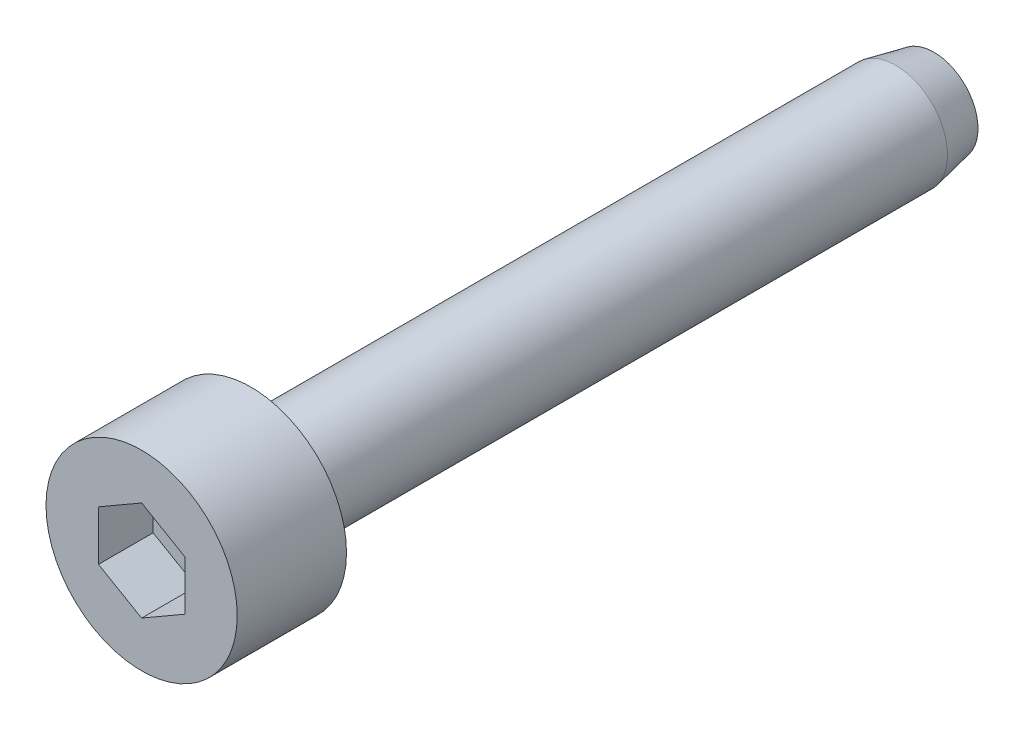
ISO-10303-21;
HEADER;
FILE_DESCRIPTION(('STEP AP214'),'2;1');
FILE_NAME('part.step','',(''),(''),'','','');
FILE_SCHEMA(('AUTOMOTIVE_DESIGN { 1 0 10303 214 1 1 1 1 }'));
ENDSEC;
DATA;
#1=APPLICATION_CONTEXT('core data for automotive mechanical design processes');
#2=APPLICATION_PROTOCOL_DEFINITION('international standard','automotive_design',2000,#1);
#3=PRODUCT_CONTEXT('',#1,'mechanical');
#4=PRODUCT('Part','Part','',(#3));
#5=PRODUCT_RELATED_PRODUCT_CATEGORY('part','',(#4));
#6=PRODUCT_DEFINITION_FORMATION('','',#4);
#7=PRODUCT_DEFINITION_CONTEXT('part definition',#1,'design');
#8=PRODUCT_DEFINITION('design','',#6,#7);
#9=PRODUCT_DEFINITION_SHAPE('','',#8);
#10=(LENGTH_UNIT() NAMED_UNIT(*) SI_UNIT(.MILLI.,.METRE.));
#11=(NAMED_UNIT(*) PLANE_ANGLE_UNIT() SI_UNIT($,.RADIAN.));
#12=(NAMED_UNIT(*) SI_UNIT($,.STERADIAN.) SOLID_ANGLE_UNIT());
#13=UNCERTAINTY_MEASURE_WITH_UNIT(LENGTH_MEASURE(1.E-05),#10,'distance_accuracy_value','');
#14=(GEOMETRIC_REPRESENTATION_CONTEXT(3) GLOBAL_UNCERTAINTY_ASSIGNED_CONTEXT((#13)) GLOBAL_UNIT_ASSIGNED_CONTEXT((#10,
#11,#12)) REPRESENTATION_CONTEXT('',''));
#15=CARTESIAN_POINT('',(0.,0.,0.));
#16=DIRECTION('',(0.,0.,1.));
#17=DIRECTION('',(1.,0.,0.));
#18=AXIS2_PLACEMENT_3D('',#15,#16,#17);
#19=CARTESIAN_POINT('',(0.,0.,-29.));
#20=DIRECTION('',(0.,0.,1.));
#21=DIRECTION('',(1.,0.,0.));
#22=AXIS2_PLACEMENT_3D('',#19,#20,#21);
#23=PLANE('',#22);
#24=CARTESIAN_POINT('',(0.,0.,-29.));
#25=DIRECTION('',(0.,0.,1.));
#26=DIRECTION('',(1.,0.,0.));
#27=AXIS2_PLACEMENT_3D('',#24,#25,#26);
#28=CIRCLE('',#27,1.615);
#29=CARTESIAN_POINT('',(1.615,0.,-29.));
#30=VERTEX_POINT('',#29);
#31=EDGE_CURVE('E11',#30,#30,#28,.T.);
#32=ORIENTED_EDGE('',*,*,#31,.F.);
#33=EDGE_LOOP('',(#32));
#34=FACE_BOUND('',#33,.T.);
#35=ADVANCED_FACE('F17',(#34),#23,.F.);
#36=CARTESIAN_POINT('',(0.,0.,-27.6));
#37=DIRECTION('',(0.,0.,1.));
#38=DIRECTION('',(1.,0.,0.));
#39=AXIS2_PLACEMENT_3D('',#36,#37,#38);
#40=CONICAL_SURFACE('',#39,1.9,0.20082725537);
#41=ORIENTED_EDGE('',*,*,#31,.T.);
#42=EDGE_LOOP('',(#41));
#43=FACE_BOUND('',#42,.T.);
#44=CARTESIAN_POINT('',(0.,0.,-27.6));
#45=DIRECTION('',(0.,0.,1.));
#46=DIRECTION('',(1.,0.,0.));
#47=AXIS2_PLACEMENT_3D('',#44,#45,#46);
#48=CIRCLE('',#47,1.9);
#49=CARTESIAN_POINT('',(1.9,0.,-27.6));
#50=VERTEX_POINT('',#49);
#51=EDGE_CURVE('E27',#50,#50,#48,.T.);
#52=ORIENTED_EDGE('',*,*,#51,.F.);
#53=EDGE_LOOP('',(#52));
#54=FACE_BOUND('',#53,.T.);
#55=ADVANCED_FACE('F19',(#43,#54),#40,.T.);
#56=CARTESIAN_POINT('',(0.,0.,-2.));
#57=DIRECTION('',(0.,0.,1.));
#58=DIRECTION('',(1.,0.,0.));
#59=AXIS2_PLACEMENT_3D('',#56,#57,#58);
#60=PLANE('',#59);
#61=DIRECTION('',(-0.866025403784329,0.50000000000019,0.));
#62=VECTOR('',#61,1.);
#63=CARTESIAN_POINT('',(1.58,0.91221342532,-2.));
#64=LINE('',#63,#62);
#65=CARTESIAN_POINT('',(1.58,0.91221342532,-2.));
#66=VERTEX_POINT('',#65);
#67=CARTESIAN_POINT('',(0.,1.824426850639,-2.));
#68=VERTEX_POINT('',#67);
#69=EDGE_CURVE('E96',#66,#68,#64,.T.);
#70=ORIENTED_EDGE('',*,*,#69,.T.);
#71=DIRECTION('',(-0.866025403784329,-0.50000000000019,0.));
#72=VECTOR('',#71,1.);
#73=CARTESIAN_POINT('',(0.,1.824426850639,-2.));
#74=LINE('',#73,#72);
#75=CARTESIAN_POINT('',(-1.58,0.91221342532,-2.));
#76=VERTEX_POINT('',#75);
#77=EDGE_CURVE('E126',#68,#76,#74,.T.);
#78=ORIENTED_EDGE('',*,*,#77,.T.);
#79=DIRECTION('',(0.,-1.,0.));
#80=VECTOR('',#79,1.);
#81=CARTESIAN_POINT('',(-1.58,0.91221342532,-2.));
#82=LINE('',#81,#80);
#83=CARTESIAN_POINT('',(-1.58,-0.91221342532,-2.));
#84=VERTEX_POINT('',#83);
#85=EDGE_CURVE('E149',#76,#84,#82,.T.);
#86=ORIENTED_EDGE('',*,*,#85,.T.);
#87=DIRECTION('',(0.866025403784329,-0.50000000000019,0.));
#88=VECTOR('',#87,1.);
#89=CARTESIAN_POINT('',(-1.58,-0.91221342532,-2.));
#90=LINE('',#89,#88);
#91=CARTESIAN_POINT('',(0.,-1.824426850639,-2.));
#92=VERTEX_POINT('',#91);
#93=EDGE_CURVE('E146',#84,#92,#90,.T.);
#94=ORIENTED_EDGE('',*,*,#93,.T.);
#95=DIRECTION('',(0.866025403784329,0.50000000000019,0.));
#96=VECTOR('',#95,1.);
#97=CARTESIAN_POINT('',(0.,-1.824426850639,-2.));
#98=LINE('',#97,#96);
#99=CARTESIAN_POINT('',(1.58,-0.91221342532,-2.));
#100=VERTEX_POINT('',#99);
#101=EDGE_CURVE('E50',#92,#100,#98,.T.);
#102=ORIENTED_EDGE('',*,*,#101,.T.);
#103=DIRECTION('',(0.,1.,0.));
#104=VECTOR('',#103,1.);
#105=CARTESIAN_POINT('',(1.58,-0.91221342532,-2.));
#106=LINE('',#105,#104);
#107=EDGE_CURVE('E36',#100,#66,#106,.T.);
#108=ORIENTED_EDGE('',*,*,#107,.T.);
#109=EDGE_LOOP('',(#70,#78,#86,#94,#102,#108));
#110=FACE_BOUND('',#109,.T.);
#111=ADVANCED_FACE('F177',(#110),#60,.T.);
#112=CARTESIAN_POINT('',(0.,0.,-29.));
#113=DIRECTION('',(0.,0.,1.));
#114=DIRECTION('',(1.,0.,0.));
#115=AXIS2_PLACEMENT_3D('',#112,#113,#114);
#116=CYLINDRICAL_SURFACE('',#115,1.9);
#117=CARTESIAN_POINT('',(0.,0.,-4.));
#118=DIRECTION('',(0.,0.,1.));
#119=DIRECTION('',(1.,0.,0.));
#120=AXIS2_PLACEMENT_3D('',#117,#118,#119);
#121=CIRCLE('',#120,1.9);
#122=CARTESIAN_POINT('',(1.9,0.,-4.));
#123=VERTEX_POINT('',#122);
#124=EDGE_CURVE('E147',#123,#123,#121,.T.);
#125=ORIENTED_EDGE('',*,*,#124,.F.);
#126=EDGE_LOOP('',(#125));
#127=FACE_BOUND('',#126,.T.);
#128=ORIENTED_EDGE('',*,*,#51,.T.);
#129=EDGE_LOOP('',(#128));
#130=FACE_BOUND('',#129,.T.);
#131=ADVANCED_FACE('F176',(#127,#130),#116,.T.);
#132=CARTESIAN_POINT('',(1.58,-0.91221342532,0.));
#133=DIRECTION('',(1.,0.,0.));
#134=DIRECTION('',(0.,1.,0.));
#135=AXIS2_PLACEMENT_3D('',#132,#133,#134);
#136=PLANE('',#135);
#137=DIRECTION('',(0.,1.,0.));
#138=VECTOR('',#137,1.);
#139=CARTESIAN_POINT('',(1.58,-0.91221342532,0.));
#140=LINE('',#139,#138);
#141=CARTESIAN_POINT('',(1.58,-0.91221342532,0.));
#142=VERTEX_POINT('',#141);
#143=CARTESIAN_POINT('',(1.58,0.91221342532,0.));
#144=VERTEX_POINT('',#143);
#145=EDGE_CURVE('E101',#142,#144,#140,.T.);
#146=ORIENTED_EDGE('',*,*,#145,.T.);
#147=DIRECTION('',(0.,0.,-1.));
#148=VECTOR('',#147,1.);
#149=CARTESIAN_POINT('',(1.58,0.91221342532,0.));
#150=LINE('',#149,#148);
#151=EDGE_CURVE('E90',#144,#66,#150,.T.);
#152=ORIENTED_EDGE('',*,*,#151,.T.);
#153=ORIENTED_EDGE('',*,*,#107,.F.);
#154=DIRECTION('',(0.,0.,-1.));
#155=VECTOR('',#154,1.);
#156=CARTESIAN_POINT('',(1.58,-0.91221342532,0.));
#157=LINE('',#156,#155);
#158=EDGE_CURVE('E103',#142,#100,#157,.T.);
#159=ORIENTED_EDGE('',*,*,#158,.F.);
#160=EDGE_LOOP('',(#146,#152,#153,#159));
#161=FACE_BOUND('',#160,.T.);
#162=ADVANCED_FACE('F105',(#161),#136,.F.);
#163=CARTESIAN_POINT('',(0.,-1.824426850639,0.));
#164=DIRECTION('',(0.50000000000019,-0.866025403784329,0.));
#165=DIRECTION('',(0.,0.,-1.));
#166=AXIS2_PLACEMENT_3D('',#163,#164,#165);
#167=PLANE('',#166);
#168=DIRECTION('',(0.866025403784329,0.50000000000019,0.));
#169=VECTOR('',#168,1.);
#170=CARTESIAN_POINT('',(0.,-1.824426850639,0.));
#171=LINE('',#170,#169);
#172=CARTESIAN_POINT('',(0.,-1.824426850639,0.));
#173=VERTEX_POINT('',#172);
#174=EDGE_CURVE('E107',#173,#142,#171,.T.);
#175=ORIENTED_EDGE('',*,*,#174,.T.);
#176=ORIENTED_EDGE('',*,*,#158,.T.);
#177=ORIENTED_EDGE('',*,*,#101,.F.);
#178=DIRECTION('',(0.,0.,-1.));
#179=VECTOR('',#178,1.);
#180=CARTESIAN_POINT('',(0.,-1.824426850639,0.));
#181=LINE('',#180,#179);
#182=EDGE_CURVE('E145',#173,#92,#181,.T.);
#183=ORIENTED_EDGE('',*,*,#182,.F.);
#184=EDGE_LOOP('',(#175,#176,#177,#183));
#185=FACE_BOUND('',#184,.T.);
#186=ADVANCED_FACE('F196',(#185),#167,.F.);
#187=CARTESIAN_POINT('',(-1.58,-0.91221342532,0.));
#188=DIRECTION('',(-0.50000000000019,-0.866025403784329,0.));
#189=DIRECTION('',(-0.866025403784329,0.50000000000019,0.));
#190=AXIS2_PLACEMENT_3D('',#187,#188,#189);
#191=PLANE('',#190);
#192=DIRECTION('',(0.866025403784329,-0.50000000000019,0.));
#193=VECTOR('',#192,1.);
#194=CARTESIAN_POINT('',(-1.58,-0.91221342532,0.));
#195=LINE('',#194,#193);
#196=CARTESIAN_POINT('',(-1.58,-0.91221342532,0.));
#197=VERTEX_POINT('',#196);
#198=EDGE_CURVE('E131',#197,#173,#195,.T.);
#199=ORIENTED_EDGE('',*,*,#198,.T.);
#200=ORIENTED_EDGE('',*,*,#182,.T.);
#201=ORIENTED_EDGE('',*,*,#93,.F.);
#202=DIRECTION('',(0.,0.,-1.));
#203=VECTOR('',#202,1.);
#204=CARTESIAN_POINT('',(-1.58,-0.91221342532,0.));
#205=LINE('',#204,#203);
#206=EDGE_CURVE('E127',#197,#84,#205,.T.);
#207=ORIENTED_EDGE('',*,*,#206,.F.);
#208=EDGE_LOOP('',(#199,#200,#201,#207));
#209=FACE_BOUND('',#208,.T.);
#210=ADVANCED_FACE('F193',(#209),#191,.F.);
#211=CARTESIAN_POINT('',(-1.58,0.91221342532,0.));
#212=DIRECTION('',(-1.,0.,0.));
#213=DIRECTION('',(0.,0.,1.));
#214=AXIS2_PLACEMENT_3D('',#211,#212,#213);
#215=PLANE('',#214);
#216=DIRECTION('',(0.,-1.,0.));
#217=VECTOR('',#216,1.);
#218=CARTESIAN_POINT('',(-1.58,0.91221342532,0.));
#219=LINE('',#218,#217);
#220=CARTESIAN_POINT('',(-1.58,0.91221342532,0.));
#221=VERTEX_POINT('',#220);
#222=EDGE_CURVE('E134',#221,#197,#219,.T.);
#223=ORIENTED_EDGE('',*,*,#222,.T.);
#224=ORIENTED_EDGE('',*,*,#206,.T.);
#225=ORIENTED_EDGE('',*,*,#85,.F.);
#226=DIRECTION('',(0.,0.,-1.));
#227=VECTOR('',#226,1.);
#228=CARTESIAN_POINT('',(-1.58,0.91221342532,0.));
#229=LINE('',#228,#227);
#230=EDGE_CURVE('E98',#221,#76,#229,.T.);
#231=ORIENTED_EDGE('',*,*,#230,.F.);
#232=EDGE_LOOP('',(#223,#224,#225,#231));
#233=FACE_BOUND('',#232,.T.);
#234=ADVANCED_FACE('F207',(#233),#215,.F.);
#235=CARTESIAN_POINT('',(0.,1.824426850639,0.));
#236=DIRECTION('',(-0.50000000000019,0.866025403784329,0.));
#237=DIRECTION('',(0.,0.,1.));
#238=AXIS2_PLACEMENT_3D('',#235,#236,#237);
#239=PLANE('',#238);
#240=DIRECTION('',(-0.866025403784329,-0.50000000000019,0.));
#241=VECTOR('',#240,1.);
#242=CARTESIAN_POINT('',(0.,1.824426850639,0.));
#243=LINE('',#242,#241);
#244=CARTESIAN_POINT('',(0.,1.824426850639,0.));
#245=VERTEX_POINT('',#244);
#246=EDGE_CURVE('E113',#245,#221,#243,.T.);
#247=ORIENTED_EDGE('',*,*,#246,.T.);
#248=ORIENTED_EDGE('',*,*,#230,.T.);
#249=ORIENTED_EDGE('',*,*,#77,.F.);
#250=DIRECTION('',(0.,0.,-1.));
#251=VECTOR('',#250,1.);
#252=CARTESIAN_POINT('',(0.,1.824426850639,0.));
#253=LINE('',#252,#251);
#254=EDGE_CURVE('E138',#245,#68,#253,.T.);
#255=ORIENTED_EDGE('',*,*,#254,.F.);
#256=EDGE_LOOP('',(#247,#248,#249,#255));
#257=FACE_BOUND('',#256,.T.);
#258=ADVANCED_FACE('F215',(#257),#239,.F.);
#259=CARTESIAN_POINT('',(1.58,0.91221342532,0.));
#260=DIRECTION('',(0.50000000000019,0.866025403784329,0.));
#261=DIRECTION('',(0.,0.,-1.));
#262=AXIS2_PLACEMENT_3D('',#259,#260,#261);
#263=PLANE('',#262);
#264=DIRECTION('',(-0.866025403784329,0.50000000000019,0.));
#265=VECTOR('',#264,1.);
#266=CARTESIAN_POINT('',(1.58,0.91221342532,0.));
#267=LINE('',#266,#265);
#268=EDGE_CURVE('E94',#144,#245,#267,.T.);
#269=ORIENTED_EDGE('',*,*,#268,.T.);
#270=ORIENTED_EDGE('',*,*,#254,.T.);
#271=ORIENTED_EDGE('',*,*,#69,.F.);
#272=ORIENTED_EDGE('',*,*,#151,.F.);
#273=EDGE_LOOP('',(#269,#270,#271,#272));
#274=FACE_BOUND('',#273,.T.);
#275=ADVANCED_FACE('F93',(#274),#263,.F.);
#276=CARTESIAN_POINT('',(0.,0.,-4.));
#277=DIRECTION('',(0.,0.,1.));
#278=DIRECTION('',(1.,0.,0.));
#279=AXIS2_PLACEMENT_3D('',#276,#277,#278);
#280=PLANE('',#279);
#281=ORIENTED_EDGE('',*,*,#124,.T.);
#282=EDGE_LOOP('',(#281));
#283=FACE_BOUND('',#282,.T.);
#284=CARTESIAN_POINT('',(0.,0.,-4.));
#285=DIRECTION('',(0.,0.,1.));
#286=DIRECTION('',(1.,0.,0.));
#287=AXIS2_PLACEMENT_3D('',#284,#285,#286);
#288=CIRCLE('',#287,3.5);
#289=CARTESIAN_POINT('',(3.5,0.,-4.));
#290=VERTEX_POINT('',#289);
#291=EDGE_CURVE('E117',#290,#290,#288,.T.);
#292=ORIENTED_EDGE('',*,*,#291,.F.);
#293=EDGE_LOOP('',(#292));
#294=FACE_BOUND('',#293,.T.);
#295=ADVANCED_FACE('F217',(#283,#294),#280,.F.);
#296=CARTESIAN_POINT('',(0.,0.,0.));
#297=DIRECTION('',(0.,0.,1.));
#298=DIRECTION('',(1.,0.,0.));
#299=AXIS2_PLACEMENT_3D('',#296,#297,#298);
#300=PLANE('',#299);
#301=ORIENTED_EDGE('',*,*,#268,.F.);
#302=ORIENTED_EDGE('',*,*,#145,.F.);
#303=ORIENTED_EDGE('',*,*,#174,.F.);
#304=ORIENTED_EDGE('',*,*,#198,.F.);
#305=ORIENTED_EDGE('',*,*,#222,.F.);
#306=ORIENTED_EDGE('',*,*,#246,.F.);
#307=EDGE_LOOP('',(#301,#302,#303,#304,#305,#306));
#308=FACE_BOUND('',#307,.T.);
#309=CARTESIAN_POINT('',(0.,0.,0.));
#310=DIRECTION('',(0.,0.,1.));
#311=DIRECTION('',(1.,0.,0.));
#312=AXIS2_PLACEMENT_3D('',#309,#310,#311);
#313=CIRCLE('',#312,3.5);
#314=CARTESIAN_POINT('',(3.5,0.,0.));
#315=VERTEX_POINT('',#314);
#316=EDGE_CURVE('E125',#315,#315,#313,.T.);
#317=ORIENTED_EDGE('',*,*,#316,.T.);
#318=EDGE_LOOP('',(#317));
#319=FACE_BOUND('',#318,.T.);
#320=ADVANCED_FACE('F112',(#308,#319),#300,.T.);
#321=CARTESIAN_POINT('',(0.,0.,-4.));
#322=DIRECTION('',(0.,0.,1.));
#323=DIRECTION('',(1.,0.,0.));
#324=AXIS2_PLACEMENT_3D('',#321,#322,#323);
#325=CYLINDRICAL_SURFACE('',#324,3.5);
#326=ORIENTED_EDGE('',*,*,#316,.F.);
#327=EDGE_LOOP('',(#326));
#328=FACE_BOUND('',#327,.T.);
#329=ORIENTED_EDGE('',*,*,#291,.T.);
#330=EDGE_LOOP('',(#329));
#331=FACE_BOUND('',#330,.T.);
#332=ADVANCED_FACE('F225',(#328,#331),#325,.T.);
#333=CLOSED_SHELL('',(#35,#55,#111,#131,#162,#186,#210,#234,#258,#275,#295,#320,#332));
#334=MANIFOLD_SOLID_BREP('B1',#333);
#335=ADVANCED_BREP_SHAPE_REPRESENTATION('',(#18,#334),#14);
#336=SHAPE_DEFINITION_REPRESENTATION(#9,#335);
ENDSEC;
END-ISO-10303-21;
